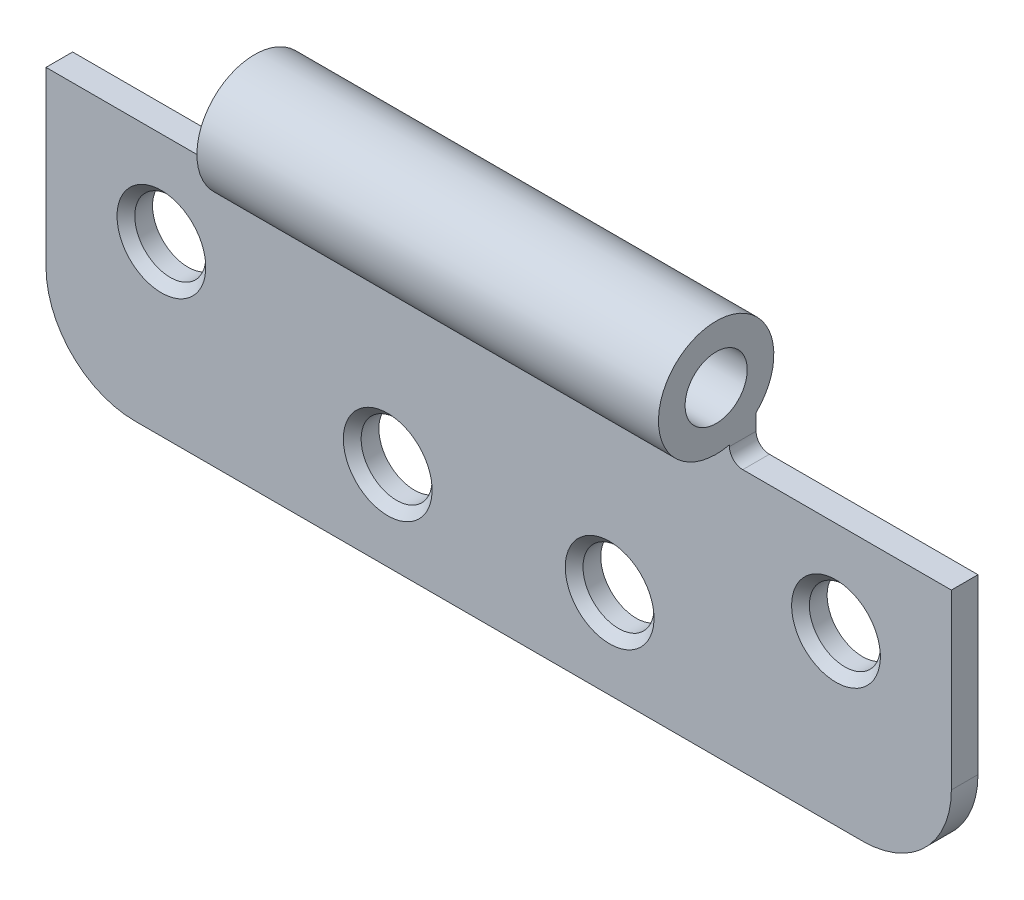
ISO-10303-21;
HEADER;
FILE_DESCRIPTION(('STEP AP214'),'2;1');
FILE_NAME('part.step','',(''),(''),'','','');
FILE_SCHEMA(('AUTOMOTIVE_DESIGN { 1 0 10303 214 1 1 1 1 }'));
ENDSEC;
DATA;
#1=APPLICATION_CONTEXT('core data for automotive mechanical design processes');
#2=APPLICATION_PROTOCOL_DEFINITION('international standard','automotive_design',2000,#1);
#3=PRODUCT_CONTEXT('',#1,'mechanical');
#4=PRODUCT('Part','Part','',(#3));
#5=PRODUCT_RELATED_PRODUCT_CATEGORY('part','',(#4));
#6=PRODUCT_DEFINITION_FORMATION('','',#4);
#7=PRODUCT_DEFINITION_CONTEXT('part definition',#1,'design');
#8=PRODUCT_DEFINITION('design','',#6,#7);
#9=PRODUCT_DEFINITION_SHAPE('','',#8);
#10=(LENGTH_UNIT() NAMED_UNIT(*) SI_UNIT(.MILLI.,.METRE.));
#11=(NAMED_UNIT(*) PLANE_ANGLE_UNIT() SI_UNIT($,.RADIAN.));
#12=(NAMED_UNIT(*) SI_UNIT($,.STERADIAN.) SOLID_ANGLE_UNIT());
#13=UNCERTAINTY_MEASURE_WITH_UNIT(LENGTH_MEASURE(1.E-05),#10,'distance_accuracy_value','');
#14=(GEOMETRIC_REPRESENTATION_CONTEXT(3) GLOBAL_UNCERTAINTY_ASSIGNED_CONTEXT((#13)) GLOBAL_UNIT_ASSIGNED_CONTEXT((#10,
#11,#12)) REPRESENTATION_CONTEXT('',''));
#15=CARTESIAN_POINT('',(0.,0.,0.));
#16=DIRECTION('',(0.,0.,1.));
#17=DIRECTION('',(1.,0.,0.));
#18=AXIS2_PLACEMENT_3D('',#15,#16,#17);
#19=CARTESIAN_POINT('',(27.5,31.,3.));
#20=DIRECTION('',(0.,0.,-1.));
#21=DIRECTION('',(-1.,0.,0.));
#22=AXIS2_PLACEMENT_3D('',#19,#20,#21);
#23=PLANE('',#22);
#24=CARTESIAN_POINT('',(38.,19.,3.));
#25=DIRECTION('',(0.,0.,-1.));
#26=DIRECTION('',(-1.,0.,0.));
#27=AXIS2_PLACEMENT_3D('',#24,#25,#26);
#28=CIRCLE('',#27,5.00000000000003);
#29=CARTESIAN_POINT('',(33.,19.,3.));
#30=VERTEX_POINT('',#29);
#31=EDGE_CURVE('E184',#30,#30,#28,.T.);
#32=ORIENTED_EDGE('',*,*,#31,.T.);
#33=EDGE_LOOP('',(#32));
#34=FACE_BOUND('',#33,.T.);
#35=CARTESIAN_POINT('',(12.5,9.99999999999998,3.));
#36=DIRECTION('',(0.,0.,-1.));
#37=DIRECTION('',(-1.,0.,0.));
#38=AXIS2_PLACEMENT_3D('',#35,#36,#37);
#39=CIRCLE('',#38,5.00000000000003);
#40=CARTESIAN_POINT('',(7.49999999999997,9.99999999999998,3.));
#41=VERTEX_POINT('',#40);
#42=EDGE_CURVE('E180',#41,#41,#39,.T.);
#43=ORIENTED_EDGE('',*,*,#42,.T.);
#44=EDGE_LOOP('',(#43));
#45=FACE_BOUND('',#44,.T.);
#46=CARTESIAN_POINT('',(-12.5,9.99999999999998,3.));
#47=DIRECTION('',(0.,0.,-1.));
#48=DIRECTION('',(-1.,0.,0.));
#49=AXIS2_PLACEMENT_3D('',#46,#47,#48);
#50=CIRCLE('',#49,5.00000000000002);
#51=CARTESIAN_POINT('',(-17.5,9.99999999999998,3.));
#52=VERTEX_POINT('',#51);
#53=EDGE_CURVE('E176',#52,#52,#50,.T.);
#54=ORIENTED_EDGE('',*,*,#53,.T.);
#55=EDGE_LOOP('',(#54));
#56=FACE_BOUND('',#55,.T.);
#57=CARTESIAN_POINT('',(-38.,19.,3.));
#58=DIRECTION('',(0.,0.,-1.));
#59=DIRECTION('',(-1.,0.,0.));
#60=AXIS2_PLACEMENT_3D('',#57,#58,#59);
#61=CIRCLE('',#60,5.00000000000003);
#62=CARTESIAN_POINT('',(-43.,19.,3.));
#63=VERTEX_POINT('',#62);
#64=EDGE_CURVE('E167',#63,#63,#61,.T.);
#65=ORIENTED_EDGE('',*,*,#64,.T.);
#66=EDGE_LOOP('',(#65));
#67=FACE_BOUND('',#66,.T.);
#68=DIRECTION('',(0.,1.,0.));
#69=VECTOR('',#68,1.);
#70=CARTESIAN_POINT('',(26.,31.,3.));
#71=LINE('',#70,#69);
#72=CARTESIAN_POINT('',(26.,31.,3.));
#73=VERTEX_POINT('',#72);
#74=CARTESIAN_POINT('',(26.,31.1754446796632,3.));
#75=VERTEX_POINT('',#74);
#76=EDGE_CURVE('E61',#73,#75,#71,.T.);
#77=ORIENTED_EDGE('',*,*,#76,.T.);
#78=DIRECTION('',(-1.,0.,0.));
#79=VECTOR('',#78,1.);
#80=CARTESIAN_POINT('',(44.3847763108502,31.1754446796632,3.));
#81=LINE('',#80,#79);
#82=CARTESIAN_POINT('',(-26.,31.1754446796632,3.));
#83=VERTEX_POINT('',#82);
#84=EDGE_CURVE('E421',#75,#83,#81,.T.);
#85=ORIENTED_EDGE('',*,*,#84,.T.);
#86=DIRECTION('',(0.,-1.,0.));
#87=VECTOR('',#86,1.);
#88=CARTESIAN_POINT('',(-26.,31.,3.));
#89=LINE('',#88,#87);
#90=CARTESIAN_POINT('',(-26.,31.,3.));
#91=VERTEX_POINT('',#90);
#92=EDGE_CURVE('E312',#83,#91,#89,.T.);
#93=ORIENTED_EDGE('',*,*,#92,.T.);
#94=CARTESIAN_POINT('',(-27.5,31.,3.));
#95=DIRECTION('',(0.,0.,-1.));
#96=DIRECTION('',(1.,0.,0.));
#97=AXIS2_PLACEMENT_3D('',#94,#95,#96);
#98=CIRCLE('',#97,1.5);
#99=CARTESIAN_POINT('',(-27.5,29.5,3.));
#100=VERTEX_POINT('',#99);
#101=EDGE_CURVE('E315',#91,#100,#98,.T.);
#102=ORIENTED_EDGE('',*,*,#101,.T.);
#103=DIRECTION('',(-1.,0.,0.));
#104=VECTOR('',#103,1.);
#105=CARTESIAN_POINT('',(-51.,29.5,3.));
#106=LINE('',#105,#104);
#107=CARTESIAN_POINT('',(-51.,29.5,3.));
#108=VERTEX_POINT('',#107);
#109=EDGE_CURVE('E318',#100,#108,#106,.T.);
#110=ORIENTED_EDGE('',*,*,#109,.T.);
#111=DIRECTION('',(0.,-1.,0.));
#112=VECTOR('',#111,1.);
#113=CARTESIAN_POINT('',(-51.,10.,3.));
#114=LINE('',#113,#112);
#115=CARTESIAN_POINT('',(-51.,10.,3.));
#116=VERTEX_POINT('',#115);
#117=EDGE_CURVE('E321',#108,#116,#114,.T.);
#118=ORIENTED_EDGE('',*,*,#117,.T.);
#119=CARTESIAN_POINT('',(-41.,10.,3.));
#120=DIRECTION('',(0.,0.,1.));
#121=DIRECTION('',(1.,0.,0.));
#122=AXIS2_PLACEMENT_3D('',#119,#120,#121);
#123=CIRCLE('',#122,10.);
#124=CARTESIAN_POINT('',(-41.,0.,3.));
#125=VERTEX_POINT('',#124);
#126=EDGE_CURVE('E324',#116,#125,#123,.T.);
#127=ORIENTED_EDGE('',*,*,#126,.T.);
#128=DIRECTION('',(1.,0.,0.));
#129=VECTOR('',#128,1.);
#130=CARTESIAN_POINT('',(-41.,0.,3.));
#131=LINE('',#130,#129);
#132=CARTESIAN_POINT('',(41.,0.,3.));
#133=VERTEX_POINT('',#132);
#134=EDGE_CURVE('E327',#125,#133,#131,.T.);
#135=ORIENTED_EDGE('',*,*,#134,.T.);
#136=CARTESIAN_POINT('',(41.,10.,3.));
#137=DIRECTION('',(0.,0.,1.));
#138=DIRECTION('',(-1.,0.,0.));
#139=AXIS2_PLACEMENT_3D('',#136,#137,#138);
#140=CIRCLE('',#139,10.);
#141=CARTESIAN_POINT('',(51.,10.,3.));
#142=VERTEX_POINT('',#141);
#143=EDGE_CURVE('E151',#133,#142,#140,.T.);
#144=ORIENTED_EDGE('',*,*,#143,.T.);
#145=DIRECTION('',(0.,1.,0.));
#146=VECTOR('',#145,1.);
#147=CARTESIAN_POINT('',(51.,10.,3.));
#148=LINE('',#147,#146);
#149=CARTESIAN_POINT('',(51.,29.5,3.));
#150=VERTEX_POINT('',#149);
#151=EDGE_CURVE('E147',#142,#150,#148,.T.);
#152=ORIENTED_EDGE('',*,*,#151,.T.);
#153=DIRECTION('',(-1.,0.,0.));
#154=VECTOR('',#153,1.);
#155=CARTESIAN_POINT('',(27.5,29.5,3.));
#156=LINE('',#155,#154);
#157=CARTESIAN_POINT('',(27.5,29.5,3.));
#158=VERTEX_POINT('',#157);
#159=EDGE_CURVE('E136',#150,#158,#156,.T.);
#160=ORIENTED_EDGE('',*,*,#159,.T.);
#161=CARTESIAN_POINT('',(27.5,31.,3.));
#162=DIRECTION('',(0.,0.,-1.));
#163=DIRECTION('',(-1.,0.,0.));
#164=AXIS2_PLACEMENT_3D('',#161,#162,#163);
#165=CIRCLE('',#164,1.5);
#166=EDGE_CURVE('E146',#158,#73,#165,.T.);
#167=ORIENTED_EDGE('',*,*,#166,.T.);
#168=EDGE_LOOP('',(#77,#85,#93,#102,#110,#118,#127,#135,#144,#152,#160,#167));
#169=FACE_BOUND('',#168,.T.);
#170=ADVANCED_FACE('F44',(#34,#45,#56,#67,#169),#23,.F.);
#171=CARTESIAN_POINT('',(27.5,31.,0.));
#172=DIRECTION('',(0.,0.,-1.));
#173=DIRECTION('',(-1.,0.,0.));
#174=AXIS2_PLACEMENT_3D('',#171,#172,#173);
#175=PLANE('',#174);
#176=DIRECTION('',(-1.,0.,0.));
#177=VECTOR('',#176,1.);
#178=CARTESIAN_POINT('',(44.3847763108502,32.8095842401766,0.));
#179=LINE('',#178,#177);
#180=CARTESIAN_POINT('',(26.,32.8095842401766,0.));
#181=VERTEX_POINT('',#180);
#182=CARTESIAN_POINT('',(-26.,32.8095842401766,0.));
#183=VERTEX_POINT('',#182);
#184=EDGE_CURVE('E69',#181,#183,#179,.T.);
#185=ORIENTED_EDGE('',*,*,#184,.F.);
#186=DIRECTION('',(0.,1.,0.));
#187=VECTOR('',#186,1.);
#188=CARTESIAN_POINT('',(26.,31.,0.));
#189=LINE('',#188,#187);
#190=CARTESIAN_POINT('',(26.,31.,0.));
#191=VERTEX_POINT('',#190);
#192=EDGE_CURVE('E341',#191,#181,#189,.T.);
#193=ORIENTED_EDGE('',*,*,#192,.F.);
#194=CARTESIAN_POINT('',(27.5,31.,0.));
#195=DIRECTION('',(0.,0.,-1.));
#196=DIRECTION('',(-1.,0.,0.));
#197=AXIS2_PLACEMENT_3D('',#194,#195,#196);
#198=CIRCLE('',#197,1.5);
#199=CARTESIAN_POINT('',(27.5,29.5,0.));
#200=VERTEX_POINT('',#199);
#201=EDGE_CURVE('E338',#200,#191,#198,.T.);
#202=ORIENTED_EDGE('',*,*,#201,.F.);
#203=DIRECTION('',(-1.,0.,0.));
#204=VECTOR('',#203,1.);
#205=CARTESIAN_POINT('',(27.5,29.5,0.));
#206=LINE('',#205,#204);
#207=CARTESIAN_POINT('',(51.,29.5,0.));
#208=VERTEX_POINT('',#207);
#209=EDGE_CURVE('E335',#208,#200,#206,.T.);
#210=ORIENTED_EDGE('',*,*,#209,.F.);
#211=DIRECTION('',(0.,1.,0.));
#212=VECTOR('',#211,1.);
#213=CARTESIAN_POINT('',(51.,10.,0.));
#214=LINE('',#213,#212);
#215=CARTESIAN_POINT('',(51.,10.,0.));
#216=VERTEX_POINT('',#215);
#217=EDGE_CURVE('E160',#216,#208,#214,.T.);
#218=ORIENTED_EDGE('',*,*,#217,.F.);
#219=CARTESIAN_POINT('',(41.,10.,0.));
#220=DIRECTION('',(0.,0.,1.));
#221=DIRECTION('',(-1.,0.,0.));
#222=AXIS2_PLACEMENT_3D('',#219,#220,#221);
#223=CIRCLE('',#222,10.);
#224=CARTESIAN_POINT('',(41.,0.,0.));
#225=VERTEX_POINT('',#224);
#226=EDGE_CURVE('E156',#225,#216,#223,.T.);
#227=ORIENTED_EDGE('',*,*,#226,.F.);
#228=DIRECTION('',(1.,0.,0.));
#229=VECTOR('',#228,1.);
#230=CARTESIAN_POINT('',(-41.,0.,0.));
#231=LINE('',#230,#229);
#232=CARTESIAN_POINT('',(-41.,0.,0.));
#233=VERTEX_POINT('',#232);
#234=EDGE_CURVE('E359',#233,#225,#231,.T.);
#235=ORIENTED_EDGE('',*,*,#234,.F.);
#236=CARTESIAN_POINT('',(-41.,10.,0.));
#237=DIRECTION('',(0.,0.,1.));
#238=DIRECTION('',(1.,0.,0.));
#239=AXIS2_PLACEMENT_3D('',#236,#237,#238);
#240=CIRCLE('',#239,10.);
#241=CARTESIAN_POINT('',(-51.,10.,0.));
#242=VERTEX_POINT('',#241);
#243=EDGE_CURVE('E356',#242,#233,#240,.T.);
#244=ORIENTED_EDGE('',*,*,#243,.F.);
#245=DIRECTION('',(0.,-1.,0.));
#246=VECTOR('',#245,1.);
#247=CARTESIAN_POINT('',(-51.,10.,0.));
#248=LINE('',#247,#246);
#249=CARTESIAN_POINT('',(-51.,29.5,0.));
#250=VERTEX_POINT('',#249);
#251=EDGE_CURVE('E353',#250,#242,#248,.T.);
#252=ORIENTED_EDGE('',*,*,#251,.F.);
#253=DIRECTION('',(-1.,0.,0.));
#254=VECTOR('',#253,1.);
#255=CARTESIAN_POINT('',(-51.,29.5,0.));
#256=LINE('',#255,#254);
#257=CARTESIAN_POINT('',(-27.5,29.5,0.));
#258=VERTEX_POINT('',#257);
#259=EDGE_CURVE('E350',#258,#250,#256,.T.);
#260=ORIENTED_EDGE('',*,*,#259,.F.);
#261=CARTESIAN_POINT('',(-27.5,31.,0.));
#262=DIRECTION('',(0.,0.,-1.));
#263=DIRECTION('',(1.,0.,0.));
#264=AXIS2_PLACEMENT_3D('',#261,#262,#263);
#265=CIRCLE('',#264,1.5);
#266=CARTESIAN_POINT('',(-26.,31.,0.));
#267=VERTEX_POINT('',#266);
#268=EDGE_CURVE('E347',#267,#258,#265,.T.);
#269=ORIENTED_EDGE('',*,*,#268,.F.);
#270=DIRECTION('',(0.,-1.,0.));
#271=VECTOR('',#270,1.);
#272=CARTESIAN_POINT('',(-26.,31.,0.));
#273=LINE('',#272,#271);
#274=EDGE_CURVE('E344',#183,#267,#273,.T.);
#275=ORIENTED_EDGE('',*,*,#274,.F.);
#276=EDGE_LOOP('',(#185,#193,#202,#210,#218,#227,#235,#244,#252,#260,#269,#275));
#277=FACE_BOUND('',#276,.T.);
#278=CARTESIAN_POINT('',(-12.5,9.99999999999998,0.));
#279=DIRECTION('',(0.,0.,1.));
#280=DIRECTION('',(1.,0.,0.));
#281=AXIS2_PLACEMENT_3D('',#278,#279,#280);
#282=CIRCLE('',#281,4.);
#283=CARTESIAN_POINT('',(-8.5,9.99999999999998,0.));
#284=VERTEX_POINT('',#283);
#285=EDGE_CURVE('E297',#284,#284,#282,.T.);
#286=ORIENTED_EDGE('',*,*,#285,.T.);
#287=EDGE_LOOP('',(#286));
#288=FACE_BOUND('',#287,.T.);
#289=CARTESIAN_POINT('',(-38.,19.,0.));
#290=DIRECTION('',(0.,0.,1.));
#291=DIRECTION('',(1.,0.,0.));
#292=AXIS2_PLACEMENT_3D('',#289,#290,#291);
#293=CIRCLE('',#292,4.00000000000001);
#294=CARTESIAN_POINT('',(-34.,19.,0.));
#295=VERTEX_POINT('',#294);
#296=EDGE_CURVE('E296',#295,#295,#293,.T.);
#297=ORIENTED_EDGE('',*,*,#296,.T.);
#298=EDGE_LOOP('',(#297));
#299=FACE_BOUND('',#298,.T.);
#300=CARTESIAN_POINT('',(38.,19.,0.));
#301=DIRECTION('',(0.,0.,1.));
#302=DIRECTION('',(1.,0.,0.));
#303=AXIS2_PLACEMENT_3D('',#300,#301,#302);
#304=CIRCLE('',#303,4.00000000000001);
#305=CARTESIAN_POINT('',(42.,19.,0.));
#306=VERTEX_POINT('',#305);
#307=EDGE_CURVE('E293',#306,#306,#304,.T.);
#308=ORIENTED_EDGE('',*,*,#307,.T.);
#309=EDGE_LOOP('',(#308));
#310=FACE_BOUND('',#309,.T.);
#311=CARTESIAN_POINT('',(12.5,9.99999999999998,0.));
#312=DIRECTION('',(0.,0.,1.));
#313=DIRECTION('',(1.,0.,0.));
#314=AXIS2_PLACEMENT_3D('',#311,#312,#313);
#315=CIRCLE('',#314,4.);
#316=CARTESIAN_POINT('',(16.5,9.99999999999998,0.));
#317=VERTEX_POINT('',#316);
#318=EDGE_CURVE('E304',#317,#317,#315,.T.);
#319=ORIENTED_EDGE('',*,*,#318,.T.);
#320=EDGE_LOOP('',(#319));
#321=FACE_BOUND('',#320,.T.);
#322=ADVANCED_FACE('F213',(#277,#288,#299,#310,#321),#175,.T.);
#323=CARTESIAN_POINT('',(51.,10.,3.));
#324=DIRECTION('',(-1.,0.,0.));
#325=DIRECTION('',(0.,-1.,0.));
#326=AXIS2_PLACEMENT_3D('',#323,#324,#325);
#327=PLANE('',#326);
#328=ORIENTED_EDGE('',*,*,#217,.T.);
#329=DIRECTION('',(0.,0.,-1.));
#330=VECTOR('',#329,1.);
#331=CARTESIAN_POINT('',(51.,29.5,3.));
#332=LINE('',#331,#330);
#333=EDGE_CURVE('E140',#150,#208,#332,.T.);
#334=ORIENTED_EDGE('',*,*,#333,.F.);
#335=ORIENTED_EDGE('',*,*,#151,.F.);
#336=DIRECTION('',(0.,0.,-1.));
#337=VECTOR('',#336,1.);
#338=CARTESIAN_POINT('',(51.,10.,3.));
#339=LINE('',#338,#337);
#340=EDGE_CURVE('E332',#142,#216,#339,.T.);
#341=ORIENTED_EDGE('',*,*,#340,.T.);
#342=EDGE_LOOP('',(#328,#334,#335,#341));
#343=FACE_BOUND('',#342,.T.);
#344=ADVANCED_FACE('F158',(#343),#327,.F.);
#345=CARTESIAN_POINT('',(27.5,29.5,3.));
#346=DIRECTION('',(0.,-1.,0.));
#347=DIRECTION('',(1.,0.,0.));
#348=AXIS2_PLACEMENT_3D('',#345,#346,#347);
#349=PLANE('',#348);
#350=ORIENTED_EDGE('',*,*,#209,.T.);
#351=DIRECTION('',(0.,0.,-1.));
#352=VECTOR('',#351,1.);
#353=CARTESIAN_POINT('',(27.5,29.5,3.));
#354=LINE('',#353,#352);
#355=EDGE_CURVE('E143',#158,#200,#354,.T.);
#356=ORIENTED_EDGE('',*,*,#355,.F.);
#357=ORIENTED_EDGE('',*,*,#159,.F.);
#358=ORIENTED_EDGE('',*,*,#333,.T.);
#359=EDGE_LOOP('',(#350,#356,#357,#358));
#360=FACE_BOUND('',#359,.T.);
#361=ADVANCED_FACE('F138',(#360),#349,.F.);
#362=CARTESIAN_POINT('',(27.5,31.,3.));
#363=DIRECTION('',(0.,0.,-1.));
#364=DIRECTION('',(-1.,0.,0.));
#365=AXIS2_PLACEMENT_3D('',#362,#363,#364);
#366=CYLINDRICAL_SURFACE('',#365,1.5);
#367=ORIENTED_EDGE('',*,*,#201,.T.);
#368=DIRECTION('',(0.,0.,-1.));
#369=VECTOR('',#368,1.);
#370=CARTESIAN_POINT('',(26.,31.,3.));
#371=LINE('',#370,#369);
#372=EDGE_CURVE('E169',#73,#191,#371,.T.);
#373=ORIENTED_EDGE('',*,*,#372,.F.);
#374=ORIENTED_EDGE('',*,*,#166,.F.);
#375=ORIENTED_EDGE('',*,*,#355,.T.);
#376=EDGE_LOOP('',(#367,#373,#374,#375));
#377=FACE_BOUND('',#376,.T.);
#378=ADVANCED_FACE('F256',(#377),#366,.F.);
#379=CARTESIAN_POINT('',(26.,31.,3.));
#380=DIRECTION('',(-1.,0.,0.));
#381=DIRECTION('',(0.,0.,1.));
#382=AXIS2_PLACEMENT_3D('',#379,#380,#381);
#383=PLANE('',#382);
#384=CARTESIAN_POINT('',(26.,37.5,4.5));
#385=DIRECTION('',(-1.,0.,0.));
#386=DIRECTION('',(0.,0.,1.));
#387=AXIS2_PLACEMENT_3D('',#384,#385,#386);
#388=CIRCLE('',#387,3.5);
#389=CARTESIAN_POINT('',(26.,37.5,8.));
#390=VERTEX_POINT('',#389);
#391=EDGE_CURVE('E425',#390,#390,#388,.T.);
#392=ORIENTED_EDGE('',*,*,#391,.T.);
#393=EDGE_LOOP('',(#392));
#394=FACE_BOUND('',#393,.T.);
#395=ORIENTED_EDGE('',*,*,#192,.T.);
#396=CARTESIAN_POINT('',(26.,37.5,4.5));
#397=DIRECTION('',(-1.,0.,0.));
#398=DIRECTION('',(0.,0.,1.));
#399=AXIS2_PLACEMENT_3D('',#396,#397,#398);
#400=CIRCLE('',#399,6.5);
#401=EDGE_CURVE('E419',#181,#75,#400,.F.);
#402=ORIENTED_EDGE('',*,*,#401,.T.);
#403=ORIENTED_EDGE('',*,*,#76,.F.);
#404=ORIENTED_EDGE('',*,*,#372,.T.);
#405=EDGE_LOOP('',(#395,#402,#403,#404));
#406=FACE_BOUND('',#405,.T.);
#407=ADVANCED_FACE('F252',(#394,#406),#383,.F.);
#408=CARTESIAN_POINT('',(-26.,31.,3.));
#409=DIRECTION('',(1.,0.,0.));
#410=DIRECTION('',(0.,0.,-1.));
#411=AXIS2_PLACEMENT_3D('',#408,#409,#410);
#412=PLANE('',#411);
#413=CARTESIAN_POINT('',(-26.,37.5,4.5));
#414=DIRECTION('',(-1.,0.,0.));
#415=DIRECTION('',(0.,0.,1.));
#416=AXIS2_PLACEMENT_3D('',#413,#414,#415);
#417=CIRCLE('',#416,3.5);
#418=CARTESIAN_POINT('',(-26.,37.5,8.));
#419=VERTEX_POINT('',#418);
#420=EDGE_CURVE('E431',#419,#419,#417,.T.);
#421=ORIENTED_EDGE('',*,*,#420,.F.);
#422=EDGE_LOOP('',(#421));
#423=FACE_BOUND('',#422,.T.);
#424=ORIENTED_EDGE('',*,*,#92,.F.);
#425=CARTESIAN_POINT('',(-26.,37.5,4.5));
#426=DIRECTION('',(-1.,0.,0.));
#427=DIRECTION('',(0.,0.,1.));
#428=AXIS2_PLACEMENT_3D('',#425,#426,#427);
#429=CIRCLE('',#428,6.5);
#430=EDGE_CURVE('E418',#83,#183,#429,.T.);
#431=ORIENTED_EDGE('',*,*,#430,.T.);
#432=ORIENTED_EDGE('',*,*,#274,.T.);
#433=DIRECTION('',(0.,0.,-1.));
#434=VECTOR('',#433,1.);
#435=CARTESIAN_POINT('',(-26.,31.,3.));
#436=LINE('',#435,#434);
#437=EDGE_CURVE('E386',#91,#267,#436,.T.);
#438=ORIENTED_EDGE('',*,*,#437,.F.);
#439=EDGE_LOOP('',(#424,#431,#432,#438));
#440=FACE_BOUND('',#439,.T.);
#441=ADVANCED_FACE('F248',(#423,#440),#412,.F.);
#442=CARTESIAN_POINT('',(-27.5,31.,3.));
#443=DIRECTION('',(0.,0.,-1.));
#444=DIRECTION('',(-1.,0.,0.));
#445=AXIS2_PLACEMENT_3D('',#442,#443,#444);
#446=CYLINDRICAL_SURFACE('',#445,1.5);
#447=ORIENTED_EDGE('',*,*,#268,.T.);
#448=DIRECTION('',(0.,0.,-1.));
#449=VECTOR('',#448,1.);
#450=CARTESIAN_POINT('',(-27.5,29.5,3.));
#451=LINE('',#450,#449);
#452=EDGE_CURVE('E382',#100,#258,#451,.T.);
#453=ORIENTED_EDGE('',*,*,#452,.F.);
#454=ORIENTED_EDGE('',*,*,#101,.F.);
#455=ORIENTED_EDGE('',*,*,#437,.T.);
#456=EDGE_LOOP('',(#447,#453,#454,#455));
#457=FACE_BOUND('',#456,.T.);
#458=ADVANCED_FACE('F244',(#457),#446,.F.);
#459=CARTESIAN_POINT('',(-51.,29.5,3.));
#460=DIRECTION('',(0.,-1.,0.));
#461=DIRECTION('',(0.,0.,-1.));
#462=AXIS2_PLACEMENT_3D('',#459,#460,#461);
#463=PLANE('',#462);
#464=ORIENTED_EDGE('',*,*,#259,.T.);
#465=DIRECTION('',(0.,0.,-1.));
#466=VECTOR('',#465,1.);
#467=CARTESIAN_POINT('',(-51.,29.5,3.));
#468=LINE('',#467,#466);
#469=EDGE_CURVE('E378',#108,#250,#468,.T.);
#470=ORIENTED_EDGE('',*,*,#469,.F.);
#471=ORIENTED_EDGE('',*,*,#109,.F.);
#472=ORIENTED_EDGE('',*,*,#452,.T.);
#473=EDGE_LOOP('',(#464,#470,#471,#472));
#474=FACE_BOUND('',#473,.T.);
#475=ADVANCED_FACE('F240',(#474),#463,.F.);
#476=CARTESIAN_POINT('',(-51.,10.,3.));
#477=DIRECTION('',(1.,0.,0.));
#478=DIRECTION('',(0.,1.,0.));
#479=AXIS2_PLACEMENT_3D('',#476,#477,#478);
#480=PLANE('',#479);
#481=ORIENTED_EDGE('',*,*,#251,.T.);
#482=DIRECTION('',(0.,0.,-1.));
#483=VECTOR('',#482,1.);
#484=CARTESIAN_POINT('',(-51.,10.,3.));
#485=LINE('',#484,#483);
#486=EDGE_CURVE('E374',#116,#242,#485,.T.);
#487=ORIENTED_EDGE('',*,*,#486,.F.);
#488=ORIENTED_EDGE('',*,*,#117,.F.);
#489=ORIENTED_EDGE('',*,*,#469,.T.);
#490=EDGE_LOOP('',(#481,#487,#488,#489));
#491=FACE_BOUND('',#490,.T.);
#492=ADVANCED_FACE('F236',(#491),#480,.F.);
#493=CARTESIAN_POINT('',(-41.,10.,3.));
#494=DIRECTION('',(0.,0.,-1.));
#495=DIRECTION('',(-1.,0.,0.));
#496=AXIS2_PLACEMENT_3D('',#493,#494,#495);
#497=CYLINDRICAL_SURFACE('',#496,10.);
#498=ORIENTED_EDGE('',*,*,#243,.T.);
#499=DIRECTION('',(0.,0.,-1.));
#500=VECTOR('',#499,1.);
#501=CARTESIAN_POINT('',(-41.,0.,3.));
#502=LINE('',#501,#500);
#503=EDGE_CURVE('E370',#125,#233,#502,.T.);
#504=ORIENTED_EDGE('',*,*,#503,.F.);
#505=ORIENTED_EDGE('',*,*,#126,.F.);
#506=ORIENTED_EDGE('',*,*,#486,.T.);
#507=EDGE_LOOP('',(#498,#504,#505,#506));
#508=FACE_BOUND('',#507,.T.);
#509=ADVANCED_FACE('F232',(#508),#497,.T.);
#510=CARTESIAN_POINT('',(-41.,0.,3.));
#511=DIRECTION('',(0.,1.,0.));
#512=DIRECTION('',(-1.,0.,0.));
#513=AXIS2_PLACEMENT_3D('',#510,#511,#512);
#514=PLANE('',#513);
#515=ORIENTED_EDGE('',*,*,#234,.T.);
#516=DIRECTION('',(0.,0.,-1.));
#517=VECTOR('',#516,1.);
#518=CARTESIAN_POINT('',(41.,0.,3.));
#519=LINE('',#518,#517);
#520=EDGE_CURVE('E366',#133,#225,#519,.T.);
#521=ORIENTED_EDGE('',*,*,#520,.F.);
#522=ORIENTED_EDGE('',*,*,#134,.F.);
#523=ORIENTED_EDGE('',*,*,#503,.T.);
#524=EDGE_LOOP('',(#515,#521,#522,#523));
#525=FACE_BOUND('',#524,.T.);
#526=ADVANCED_FACE('F228',(#525),#514,.F.);
#527=CARTESIAN_POINT('',(41.,10.,3.));
#528=DIRECTION('',(0.,0.,-1.));
#529=DIRECTION('',(-1.,0.,0.));
#530=AXIS2_PLACEMENT_3D('',#527,#528,#529);
#531=CYLINDRICAL_SURFACE('',#530,10.);
#532=ORIENTED_EDGE('',*,*,#226,.T.);
#533=ORIENTED_EDGE('',*,*,#340,.F.);
#534=ORIENTED_EDGE('',*,*,#143,.F.);
#535=ORIENTED_EDGE('',*,*,#520,.T.);
#536=EDGE_LOOP('',(#532,#533,#534,#535));
#537=FACE_BOUND('',#536,.T.);
#538=ADVANCED_FACE('F225',(#537),#531,.T.);
#539=CARTESIAN_POINT('',(-38.,19.,3.));
#540=DIRECTION('',(0.,0.,-1.));
#541=DIRECTION('',(-1.,0.,0.));
#542=AXIS2_PLACEMENT_3D('',#539,#540,#541);
#543=CYLINDRICAL_SURFACE('',#542,4.00000000000001);
#544=CARTESIAN_POINT('',(-38.,19.,1.99999999999999));
#545=DIRECTION('',(0.,0.,-1.));
#546=DIRECTION('',(-1.,0.,0.));
#547=AXIS2_PLACEMENT_3D('',#544,#545,#546);
#548=CIRCLE('',#547,4.00000000000001);
#549=CARTESIAN_POINT('',(-42.,19.,1.99999999999999));
#550=VERTEX_POINT('',#549);
#551=EDGE_CURVE('E11',#550,#550,#548,.F.);
#552=ORIENTED_EDGE('',*,*,#551,.T.);
#553=EDGE_LOOP('',(#552));
#554=FACE_BOUND('',#553,.T.);
#555=ORIENTED_EDGE('',*,*,#296,.F.);
#556=EDGE_LOOP('',(#555));
#557=FACE_BOUND('',#556,.T.);
#558=ADVANCED_FACE('F222',(#554,#557),#543,.F.);
#559=CARTESIAN_POINT('',(38.,19.,3.));
#560=DIRECTION('',(0.,0.,-1.));
#561=DIRECTION('',(-1.,0.,0.));
#562=AXIS2_PLACEMENT_3D('',#559,#560,#561);
#563=CYLINDRICAL_SURFACE('',#562,4.00000000000001);
#564=CARTESIAN_POINT('',(38.,19.,1.99999999999999));
#565=DIRECTION('',(0.,0.,-1.));
#566=DIRECTION('',(-1.,0.,0.));
#567=AXIS2_PLACEMENT_3D('',#564,#565,#566);
#568=CIRCLE('',#567,4.00000000000001);
#569=CARTESIAN_POINT('',(34.,19.,1.99999999999999));
#570=VERTEX_POINT('',#569);
#571=EDGE_CURVE('E162',#570,#570,#568,.F.);
#572=ORIENTED_EDGE('',*,*,#571,.T.);
#573=EDGE_LOOP('',(#572));
#574=FACE_BOUND('',#573,.T.);
#575=ORIENTED_EDGE('',*,*,#307,.F.);
#576=EDGE_LOOP('',(#575));
#577=FACE_BOUND('',#576,.T.);
#578=ADVANCED_FACE('F288',(#574,#577),#563,.F.);
#579=CARTESIAN_POINT('',(-12.5,9.99999999999998,3.));
#580=DIRECTION('',(0.,0.,-1.));
#581=DIRECTION('',(-1.,0.,0.));
#582=AXIS2_PLACEMENT_3D('',#579,#580,#581);
#583=CYLINDRICAL_SURFACE('',#582,4.);
#584=CARTESIAN_POINT('',(-12.5,9.99999999999998,2.));
#585=DIRECTION('',(0.,0.,-1.));
#586=DIRECTION('',(-1.,0.,0.));
#587=AXIS2_PLACEMENT_3D('',#584,#585,#586);
#588=CIRCLE('',#587,4.);
#589=CARTESIAN_POINT('',(-16.5,9.99999999999998,2.));
#590=VERTEX_POINT('',#589);
#591=EDGE_CURVE('E54',#590,#590,#588,.F.);
#592=ORIENTED_EDGE('',*,*,#591,.T.);
#593=EDGE_LOOP('',(#592));
#594=FACE_BOUND('',#593,.T.);
#595=ORIENTED_EDGE('',*,*,#285,.F.);
#596=EDGE_LOOP('',(#595));
#597=FACE_BOUND('',#596,.T.);
#598=ADVANCED_FACE('F195',(#594,#597),#583,.F.);
#599=CARTESIAN_POINT('',(12.5,9.99999999999998,3.));
#600=DIRECTION('',(0.,0.,-1.));
#601=DIRECTION('',(-1.,0.,0.));
#602=AXIS2_PLACEMENT_3D('',#599,#600,#601);
#603=CYLINDRICAL_SURFACE('',#602,4.);
#604=CARTESIAN_POINT('',(12.5,9.99999999999998,1.99999999999998));
#605=DIRECTION('',(0.,0.,-1.));
#606=DIRECTION('',(-1.,0.,0.));
#607=AXIS2_PLACEMENT_3D('',#604,#605,#606);
#608=CIRCLE('',#607,4.);
#609=CARTESIAN_POINT('',(8.5,9.99999999999998,1.99999999999998));
#610=VERTEX_POINT('',#609);
#611=EDGE_CURVE('E188',#610,#610,#608,.F.);
#612=ORIENTED_EDGE('',*,*,#611,.T.);
#613=EDGE_LOOP('',(#612));
#614=FACE_BOUND('',#613,.T.);
#615=ORIENTED_EDGE('',*,*,#318,.F.);
#616=EDGE_LOOP('',(#615));
#617=FACE_BOUND('',#616,.T.);
#618=ADVANCED_FACE('F441',(#614,#617),#603,.F.);
#619=CARTESIAN_POINT('',(44.3847763108502,37.5,4.5));
#620=DIRECTION('',(-1.,0.,0.));
#621=DIRECTION('',(0.,0.,1.));
#622=AXIS2_PLACEMENT_3D('',#619,#620,#621);
#623=CYLINDRICAL_SURFACE('',#622,6.5);
#624=ORIENTED_EDGE('',*,*,#84,.F.);
#625=ORIENTED_EDGE('',*,*,#401,.F.);
#626=ORIENTED_EDGE('',*,*,#184,.T.);
#627=ORIENTED_EDGE('',*,*,#430,.F.);
#628=EDGE_LOOP('',(#624,#625,#626,#627));
#629=FACE_BOUND('',#628,.T.);
#630=ADVANCED_FACE('F281',(#629),#623,.T.);
#631=CARTESIAN_POINT('',(51.,37.5,4.5));
#632=DIRECTION('',(-1.,0.,0.));
#633=DIRECTION('',(0.,0.,1.));
#634=AXIS2_PLACEMENT_3D('',#631,#632,#633);
#635=CYLINDRICAL_SURFACE('',#634,3.5);
#636=ORIENTED_EDGE('',*,*,#420,.T.);
#637=EDGE_LOOP('',(#636));
#638=FACE_BOUND('',#637,.T.);
#639=ORIENTED_EDGE('',*,*,#391,.F.);
#640=EDGE_LOOP('',(#639));
#641=FACE_BOUND('',#640,.T.);
#642=ADVANCED_FACE('F270',(#638,#641),#635,.F.);
#643=CARTESIAN_POINT('',(38.,19.,1.99999999999999));
#644=DIRECTION('',(0.,0.,1.));
#645=DIRECTION('',(1.,0.,0.));
#646=AXIS2_PLACEMENT_3D('',#643,#644,#645);
#647=CONICAL_SURFACE('',#646,4.00000000000001,0.785398163397455);
#648=ORIENTED_EDGE('',*,*,#31,.F.);
#649=EDGE_LOOP('',(#648));
#650=FACE_BOUND('',#649,.T.);
#651=ORIENTED_EDGE('',*,*,#571,.F.);
#652=EDGE_LOOP('',(#651));
#653=FACE_BOUND('',#652,.T.);
#654=ADVANCED_FACE('F207',(#650,#653),#647,.F.);
#655=CARTESIAN_POINT('',(12.5,9.99999999999998,1.99999999999998));
#656=DIRECTION('',(0.,0.,1.));
#657=DIRECTION('',(1.,0.,0.));
#658=AXIS2_PLACEMENT_3D('',#655,#656,#657);
#659=CONICAL_SURFACE('',#658,4.,0.785398163397455);
#660=ORIENTED_EDGE('',*,*,#42,.F.);
#661=EDGE_LOOP('',(#660));
#662=FACE_BOUND('',#661,.T.);
#663=ORIENTED_EDGE('',*,*,#611,.F.);
#664=EDGE_LOOP('',(#663));
#665=FACE_BOUND('',#664,.T.);
#666=ADVANCED_FACE('F200',(#662,#665),#659,.F.);
#667=CARTESIAN_POINT('',(-12.5,9.99999999999998,2.));
#668=DIRECTION('',(0.,0.,1.));
#669=DIRECTION('',(1.,0.,0.));
#670=AXIS2_PLACEMENT_3D('',#667,#668,#669);
#671=CONICAL_SURFACE('',#670,4.,0.785398163397455);
#672=ORIENTED_EDGE('',*,*,#53,.F.);
#673=EDGE_LOOP('',(#672));
#674=FACE_BOUND('',#673,.T.);
#675=ORIENTED_EDGE('',*,*,#591,.F.);
#676=EDGE_LOOP('',(#675));
#677=FACE_BOUND('',#676,.T.);
#678=ADVANCED_FACE('F198',(#674,#677),#671,.F.);
#679=CARTESIAN_POINT('',(-38.,19.,1.99999999999999));
#680=DIRECTION('',(0.,0.,1.));
#681=DIRECTION('',(1.,0.,0.));
#682=AXIS2_PLACEMENT_3D('',#679,#680,#681);
#683=CONICAL_SURFACE('',#682,4.00000000000001,0.785398163397455);
#684=ORIENTED_EDGE('',*,*,#64,.F.);
#685=EDGE_LOOP('',(#684));
#686=FACE_BOUND('',#685,.T.);
#687=ORIENTED_EDGE('',*,*,#551,.F.);
#688=EDGE_LOOP('',(#687));
#689=FACE_BOUND('',#688,.T.);
#690=ADVANCED_FACE('F47',(#686,#689),#683,.F.);
#691=CLOSED_SHELL('',(#170,#322,#344,#361,#378,#407,#441,#458,#475,#492,#509,#526,#538,#558,
#578,#598,#618,#630,#642,#654,#666,#678,#690));
#692=MANIFOLD_SOLID_BREP('B2',#691);
#693=ADVANCED_BREP_SHAPE_REPRESENTATION('',(#18,#692),#14);
#694=SHAPE_DEFINITION_REPRESENTATION(#9,#693);
ENDSEC;
END-ISO-10303-21;
